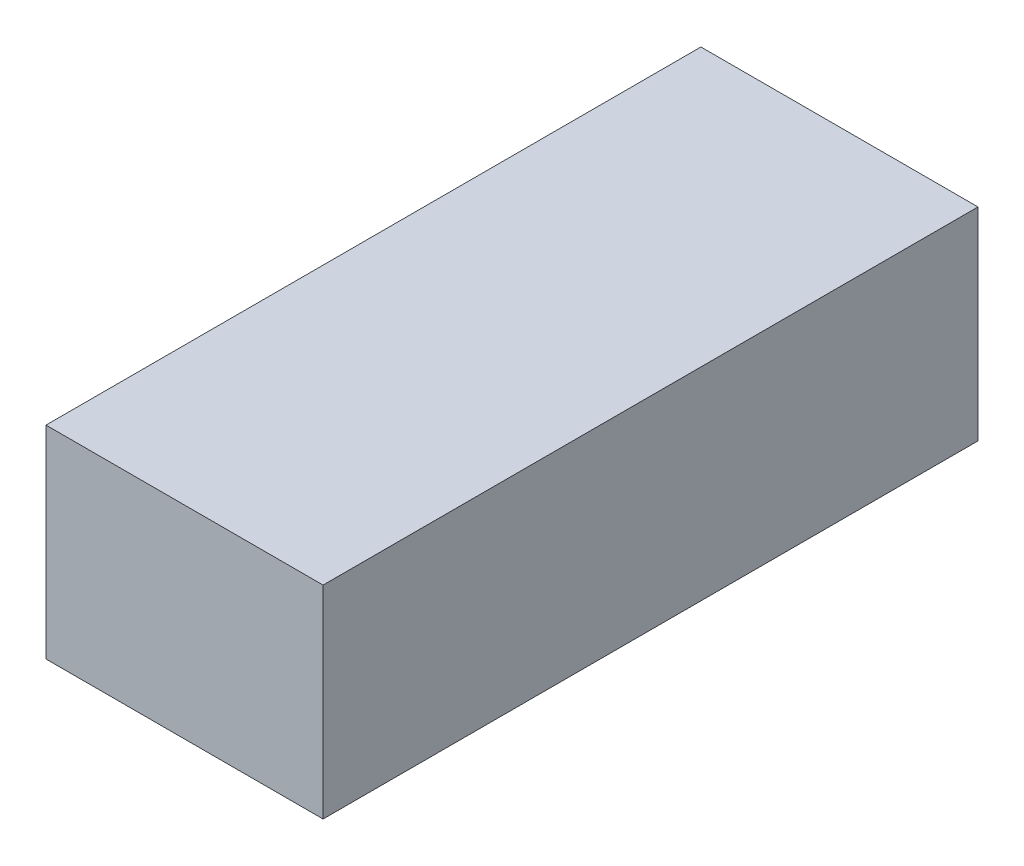
ISO-10303-21;
HEADER;
FILE_DESCRIPTION(('STEP AP214'),'2;1');
FILE_NAME('part.step','',(''),(''),'','','');
FILE_SCHEMA(('AUTOMOTIVE_DESIGN { 1 0 10303 214 1 1 1 1 }'));
ENDSEC;
DATA;
#1=APPLICATION_CONTEXT('core data for automotive mechanical design processes');
#2=APPLICATION_PROTOCOL_DEFINITION('international standard','automotive_design',2000,#1);
#3=PRODUCT_CONTEXT('',#1,'mechanical');
#4=PRODUCT('Part','Part','',(#3));
#5=PRODUCT_RELATED_PRODUCT_CATEGORY('part','',(#4));
#6=PRODUCT_DEFINITION_FORMATION('','',#4);
#7=PRODUCT_DEFINITION_CONTEXT('part definition',#1,'design');
#8=PRODUCT_DEFINITION('design','',#6,#7);
#9=PRODUCT_DEFINITION_SHAPE('','',#8);
#10=(LENGTH_UNIT() NAMED_UNIT(*) SI_UNIT(.MILLI.,.METRE.));
#11=(NAMED_UNIT(*) PLANE_ANGLE_UNIT() SI_UNIT($,.RADIAN.));
#12=(NAMED_UNIT(*) SI_UNIT($,.STERADIAN.) SOLID_ANGLE_UNIT());
#13=UNCERTAINTY_MEASURE_WITH_UNIT(LENGTH_MEASURE(1.E-05),#10,'distance_accuracy_value','');
#14=(GEOMETRIC_REPRESENTATION_CONTEXT(3) GLOBAL_UNCERTAINTY_ASSIGNED_CONTEXT((#13)) GLOBAL_UNIT_ASSIGNED_CONTEXT((#10,
#11,#12)) REPRESENTATION_CONTEXT('',''));
#15=CARTESIAN_POINT('',(0.,0.,0.));
#16=DIRECTION('',(0.,0.,1.));
#17=DIRECTION('',(1.,0.,0.));
#18=AXIS2_PLACEMENT_3D('',#15,#16,#17);
#19=CARTESIAN_POINT('',(-34.925,51.0794,-165.1));
#20=DIRECTION('',(1.,0.,0.));
#21=DIRECTION('',(0.,0.,-1.));
#22=AXIS2_PLACEMENT_3D('',#19,#20,#21);
#23=PLANE('',#22);
#24=DIRECTION('',(0.,0.,1.));
#25=VECTOR('',#24,1.);
#26=CARTESIAN_POINT('',(-34.925,0.,-165.1));
#27=LINE('',#26,#25);
#28=CARTESIAN_POINT('',(-34.925,0.,-165.1));
#29=VERTEX_POINT('',#28);
#30=CARTESIAN_POINT('',(-34.925,0.,0.));
#31=VERTEX_POINT('',#30);
#32=EDGE_CURVE('E104',#29,#31,#27,.T.);
#33=ORIENTED_EDGE('',*,*,#32,.T.);
#34=DIRECTION('',(0.,-1.,0.));
#35=VECTOR('',#34,1.);
#36=CARTESIAN_POINT('',(-34.925,51.0794,0.));
#37=LINE('',#36,#35);
#38=CARTESIAN_POINT('',(-34.925,51.0794,0.));
#39=VERTEX_POINT('',#38);
#40=EDGE_CURVE('E11',#39,#31,#37,.T.);
#41=ORIENTED_EDGE('',*,*,#40,.F.);
#42=DIRECTION('',(0.,0.,1.));
#43=VECTOR('',#42,1.);
#44=CARTESIAN_POINT('',(-34.925,51.0794,-165.1));
#45=LINE('',#44,#43);
#46=CARTESIAN_POINT('',(-34.925,51.0794,-165.1));
#47=VERTEX_POINT('',#46);
#48=EDGE_CURVE('E92',#47,#39,#45,.T.);
#49=ORIENTED_EDGE('',*,*,#48,.F.);
#50=DIRECTION('',(0.,-1.,0.));
#51=VECTOR('',#50,1.);
#52=CARTESIAN_POINT('',(-34.925,51.0794,-165.1));
#53=LINE('',#52,#51);
#54=EDGE_CURVE('E100',#47,#29,#53,.T.);
#55=ORIENTED_EDGE('',*,*,#54,.T.);
#56=EDGE_LOOP('',(#33,#41,#49,#55));
#57=FACE_BOUND('',#56,.T.);
#58=ADVANCED_FACE('F40',(#57),#23,.F.);
#59=CARTESIAN_POINT('',(-34.925,51.0794,0.));
#60=DIRECTION('',(0.,0.,-1.));
#61=DIRECTION('',(-1.,0.,0.));
#62=AXIS2_PLACEMENT_3D('',#59,#60,#61);
#63=PLANE('',#62);
#64=DIRECTION('',(1.,0.,0.));
#65=VECTOR('',#64,1.);
#66=CARTESIAN_POINT('',(-34.925,0.,0.));
#67=LINE('',#66,#65);
#68=CARTESIAN_POINT('',(34.925,0.,0.));
#69=VERTEX_POINT('',#68);
#70=EDGE_CURVE('E96',#31,#69,#67,.T.);
#71=ORIENTED_EDGE('',*,*,#70,.T.);
#72=DIRECTION('',(0.,-1.,0.));
#73=VECTOR('',#72,1.);
#74=CARTESIAN_POINT('',(34.925,51.0794,0.));
#75=LINE('',#74,#73);
#76=CARTESIAN_POINT('',(34.925,51.0794,0.));
#77=VERTEX_POINT('',#76);
#78=EDGE_CURVE('E49',#77,#69,#75,.T.);
#79=ORIENTED_EDGE('',*,*,#78,.F.);
#80=DIRECTION('',(1.,0.,0.));
#81=VECTOR('',#80,1.);
#82=CARTESIAN_POINT('',(-34.925,51.0794,0.));
#83=LINE('',#82,#81);
#84=EDGE_CURVE('E87',#39,#77,#83,.T.);
#85=ORIENTED_EDGE('',*,*,#84,.F.);
#86=ORIENTED_EDGE('',*,*,#40,.T.);
#87=EDGE_LOOP('',(#71,#79,#85,#86));
#88=FACE_BOUND('',#87,.T.);
#89=ADVANCED_FACE('F95',(#88),#63,.F.);
#90=CARTESIAN_POINT('',(34.925,51.0794,-165.1));
#91=DIRECTION('',(-1.,0.,0.));
#92=DIRECTION('',(0.,0.,1.));
#93=AXIS2_PLACEMENT_3D('',#90,#91,#92);
#94=PLANE('',#93);
#95=DIRECTION('',(0.,0.,-1.));
#96=VECTOR('',#95,1.);
#97=CARTESIAN_POINT('',(34.925,0.,-165.1));
#98=LINE('',#97,#96);
#99=CARTESIAN_POINT('',(34.925,0.,-165.1));
#100=VERTEX_POINT('',#99);
#101=EDGE_CURVE('E74',#69,#100,#98,.T.);
#102=ORIENTED_EDGE('',*,*,#101,.T.);
#103=DIRECTION('',(0.,-1.,0.));
#104=VECTOR('',#103,1.);
#105=CARTESIAN_POINT('',(34.925,51.0794,-165.1));
#106=LINE('',#105,#104);
#107=CARTESIAN_POINT('',(34.925,51.0794,-165.1));
#108=VERTEX_POINT('',#107);
#109=EDGE_CURVE('E97',#108,#100,#106,.T.);
#110=ORIENTED_EDGE('',*,*,#109,.F.);
#111=DIRECTION('',(0.,0.,-1.));
#112=VECTOR('',#111,1.);
#113=CARTESIAN_POINT('',(34.925,51.0794,-165.1));
#114=LINE('',#113,#112);
#115=EDGE_CURVE('E90',#77,#108,#114,.T.);
#116=ORIENTED_EDGE('',*,*,#115,.F.);
#117=ORIENTED_EDGE('',*,*,#78,.T.);
#118=EDGE_LOOP('',(#102,#110,#116,#117));
#119=FACE_BOUND('',#118,.T.);
#120=ADVANCED_FACE('F98',(#119),#94,.F.);
#121=CARTESIAN_POINT('',(-34.925,51.0794,-165.1));
#122=DIRECTION('',(0.,0.,1.));
#123=DIRECTION('',(1.,0.,0.));
#124=AXIS2_PLACEMENT_3D('',#121,#122,#123);
#125=PLANE('',#124);
#126=DIRECTION('',(-1.,0.,0.));
#127=VECTOR('',#126,1.);
#128=CARTESIAN_POINT('',(-34.925,0.,-165.1));
#129=LINE('',#128,#127);
#130=EDGE_CURVE('E80',#100,#29,#129,.T.);
#131=ORIENTED_EDGE('',*,*,#130,.T.);
#132=ORIENTED_EDGE('',*,*,#54,.F.);
#133=DIRECTION('',(-1.,0.,0.));
#134=VECTOR('',#133,1.);
#135=CARTESIAN_POINT('',(-34.925,51.0794,-165.1));
#136=LINE('',#135,#134);
#137=EDGE_CURVE('E57',#108,#47,#136,.T.);
#138=ORIENTED_EDGE('',*,*,#137,.F.);
#139=ORIENTED_EDGE('',*,*,#109,.T.);
#140=EDGE_LOOP('',(#131,#132,#138,#139));
#141=FACE_BOUND('',#140,.T.);
#142=ADVANCED_FACE('F113',(#141),#125,.F.);
#143=CARTESIAN_POINT('',(0.,51.0794,0.));
#144=DIRECTION('',(0.,1.,0.));
#145=DIRECTION('',(0.,0.,1.));
#146=AXIS2_PLACEMENT_3D('',#143,#144,#145);
#147=PLANE('',#146);
#148=ORIENTED_EDGE('',*,*,#48,.T.);
#149=ORIENTED_EDGE('',*,*,#84,.T.);
#150=ORIENTED_EDGE('',*,*,#115,.T.);
#151=ORIENTED_EDGE('',*,*,#137,.T.);
#152=EDGE_LOOP('',(#148,#149,#150,#151));
#153=FACE_BOUND('',#152,.T.);
#154=ADVANCED_FACE('F88',(#153),#147,.T.);
#155=CARTESIAN_POINT('',(0.,0.,0.));
#156=DIRECTION('',(0.,1.,0.));
#157=DIRECTION('',(0.,0.,1.));
#158=AXIS2_PLACEMENT_3D('',#155,#156,#157);
#159=PLANE('',#158);
#160=ORIENTED_EDGE('',*,*,#32,.F.);
#161=ORIENTED_EDGE('',*,*,#130,.F.);
#162=ORIENTED_EDGE('',*,*,#101,.F.);
#163=ORIENTED_EDGE('',*,*,#70,.F.);
#164=EDGE_LOOP('',(#160,#161,#162,#163));
#165=FACE_BOUND('',#164,.T.);
#166=ADVANCED_FACE('F116',(#165),#159,.F.);
#167=CLOSED_SHELL('',(#58,#89,#120,#142,#154,#166));
#168=MANIFOLD_SOLID_BREP('B2',#167);
#169=ADVANCED_BREP_SHAPE_REPRESENTATION('',(#18,#168),#14);
#170=SHAPE_DEFINITION_REPRESENTATION(#9,#169);
ENDSEC;
END-ISO-10303-21;
